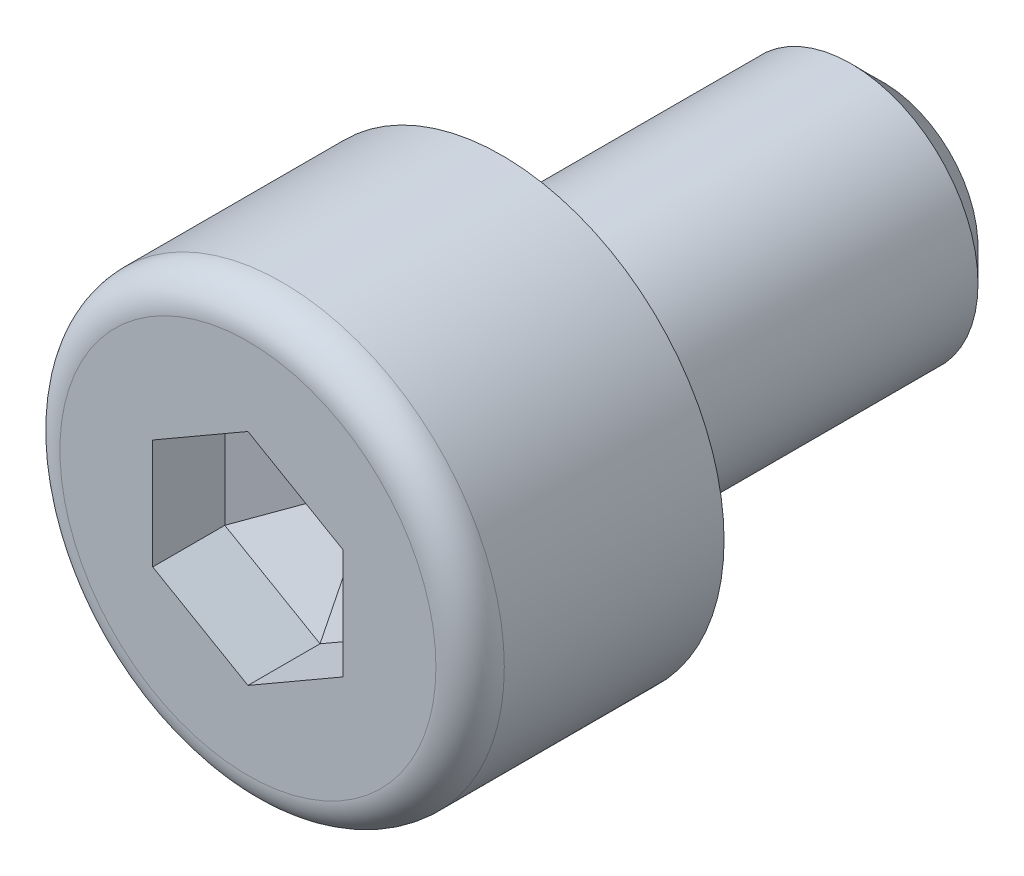
ISO-10303-21;
HEADER;
FILE_DESCRIPTION(('STEP AP214'),'2;1');
FILE_NAME('part.step','',(''),(''),'','','');
FILE_SCHEMA(('AUTOMOTIVE_DESIGN { 1 0 10303 214 1 1 1 1 }'));
ENDSEC;
DATA;
#1=APPLICATION_CONTEXT('core data for automotive mechanical design processes');
#2=APPLICATION_PROTOCOL_DEFINITION('international standard','automotive_design',2000,#1);
#3=PRODUCT_CONTEXT('',#1,'mechanical');
#4=PRODUCT('Part','Part','',(#3));
#5=PRODUCT_RELATED_PRODUCT_CATEGORY('part','',(#4));
#6=PRODUCT_DEFINITION_FORMATION('','',#4);
#7=PRODUCT_DEFINITION_CONTEXT('part definition',#1,'design');
#8=PRODUCT_DEFINITION('design','',#6,#7);
#9=PRODUCT_DEFINITION_SHAPE('','',#8);
#10=(LENGTH_UNIT() NAMED_UNIT(*) SI_UNIT(.MILLI.,.METRE.));
#11=(NAMED_UNIT(*) PLANE_ANGLE_UNIT() SI_UNIT($,.RADIAN.));
#12=(NAMED_UNIT(*) SI_UNIT($,.STERADIAN.) SOLID_ANGLE_UNIT());
#13=UNCERTAINTY_MEASURE_WITH_UNIT(LENGTH_MEASURE(1.E-05),#10,'distance_accuracy_value','');
#14=(GEOMETRIC_REPRESENTATION_CONTEXT(3) GLOBAL_UNCERTAINTY_ASSIGNED_CONTEXT((#13)) GLOBAL_UNIT_ASSIGNED_CONTEXT((#10,
#11,#12)) REPRESENTATION_CONTEXT('',''));
#15=CARTESIAN_POINT('',(0.,0.,0.));
#16=DIRECTION('',(0.,0.,1.));
#17=DIRECTION('',(1.,0.,0.));
#18=AXIS2_PLACEMENT_3D('',#15,#16,#17);
#19=CARTESIAN_POINT('',(0.,0.,0.));
#20=DIRECTION('',(0.,0.,1.));
#21=DIRECTION('',(1.,0.,0.));
#22=AXIS2_PLACEMENT_3D('',#19,#20,#21);
#23=PLANE('',#22);
#24=CARTESIAN_POINT('',(0.,0.,0.));
#25=DIRECTION('',(0.,0.,1.));
#26=DIRECTION('',(1.,0.,0.));
#27=AXIS2_PLACEMENT_3D('',#24,#25,#26);
#28=CIRCLE('',#27,2.1);
#29=CARTESIAN_POINT('',(2.1,0.,0.));
#30=VERTEX_POINT('',#29);
#31=EDGE_CURVE('E11',#30,#30,#28,.T.);
#32=ORIENTED_EDGE('',*,*,#31,.T.);
#33=EDGE_LOOP('',(#32));
#34=FACE_BOUND('',#33,.T.);
#35=CARTESIAN_POINT('',(0.,0.,0.));
#36=DIRECTION('',(0.,0.,1.));
#37=DIRECTION('',(1.,0.,0.));
#38=AXIS2_PLACEMENT_3D('',#35,#36,#37);
#39=CIRCLE('',#38,3.5);
#40=CARTESIAN_POINT('',(3.5,0.,0.));
#41=VERTEX_POINT('',#40);
#42=EDGE_CURVE('E153',#41,#41,#39,.T.);
#43=ORIENTED_EDGE('',*,*,#42,.F.);
#44=EDGE_LOOP('',(#43));
#45=FACE_BOUND('',#44,.T.);
#46=ADVANCED_FACE('F44',(#34,#45),#23,.F.);
#47=CARTESIAN_POINT('',(0.,0.,4.));
#48=DIRECTION('',(0.,0.,-1.));
#49=DIRECTION('',(-1.,0.,0.));
#50=AXIS2_PLACEMENT_3D('',#47,#48,#49);
#51=CYLINDRICAL_SURFACE('',#50,3.5);
#52=CARTESIAN_POINT('',(0.,0.,3.46153846153846));
#53=DIRECTION('',(0.,0.,1.));
#54=DIRECTION('',(1.,0.,0.));
#55=AXIS2_PLACEMENT_3D('',#52,#53,#54);
#56=CIRCLE('',#55,3.5);
#57=CARTESIAN_POINT('',(3.5,0.,3.46153846153846));
#58=VERTEX_POINT('',#57);
#59=EDGE_CURVE('E173',#58,#58,#56,.F.);
#60=ORIENTED_EDGE('',*,*,#59,.T.);
#61=EDGE_LOOP('',(#60));
#62=FACE_BOUND('',#61,.T.);
#63=ORIENTED_EDGE('',*,*,#42,.T.);
#64=EDGE_LOOP('',(#63));
#65=FACE_BOUND('',#64,.T.);
#66=ADVANCED_FACE('F235',(#62,#65),#51,.T.);
#67=CARTESIAN_POINT('',(0.,0.,4.));
#68=DIRECTION('',(0.,0.,1.));
#69=DIRECTION('',(1.,0.,0.));
#70=AXIS2_PLACEMENT_3D('',#67,#68,#69);
#71=PLANE('',#70);
#72=CARTESIAN_POINT('',(0.,0.,4.));
#73=DIRECTION('',(0.,0.,1.));
#74=DIRECTION('',(1.,0.,0.));
#75=AXIS2_PLACEMENT_3D('',#72,#73,#74);
#76=CIRCLE('',#75,2.96153846153846);
#77=CARTESIAN_POINT('',(2.96153846153846,0.,4.));
#78=VERTEX_POINT('',#77);
#79=EDGE_CURVE('E167',#78,#78,#76,.T.);
#80=ORIENTED_EDGE('',*,*,#79,.T.);
#81=EDGE_LOOP('',(#80));
#82=FACE_BOUND('',#81,.T.);
#83=DIRECTION('',(0.,1.,0.));
#84=VECTOR('',#83,1.);
#85=CARTESIAN_POINT('',(1.5,-0.866025403784439,4.));
#86=LINE('',#85,#84);
#87=CARTESIAN_POINT('',(1.5,-0.866025403784439,4.));
#88=VERTEX_POINT('',#87);
#89=CARTESIAN_POINT('',(1.5,0.866025403784439,4.));
#90=VERTEX_POINT('',#89);
#91=EDGE_CURVE('E140',#88,#90,#86,.T.);
#92=ORIENTED_EDGE('',*,*,#91,.F.);
#93=DIRECTION('',(0.866025403784439,0.5,0.));
#94=VECTOR('',#93,1.);
#95=CARTESIAN_POINT('',(0.,-1.73205080756888,4.));
#96=LINE('',#95,#94);
#97=CARTESIAN_POINT('',(0.,-1.73205080756888,4.));
#98=VERTEX_POINT('',#97);
#99=EDGE_CURVE('E149',#98,#88,#96,.T.);
#100=ORIENTED_EDGE('',*,*,#99,.F.);
#101=DIRECTION('',(0.866025403784439,-0.5,0.));
#102=VECTOR('',#101,1.);
#103=CARTESIAN_POINT('',(-1.5,-0.866025403784438,4.));
#104=LINE('',#103,#102);
#105=CARTESIAN_POINT('',(-1.5,-0.866025403784438,4.));
#106=VERTEX_POINT('',#105);
#107=EDGE_CURVE('E144',#106,#98,#104,.T.);
#108=ORIENTED_EDGE('',*,*,#107,.F.);
#109=DIRECTION('',(0.,-1.,0.));
#110=VECTOR('',#109,1.);
#111=CARTESIAN_POINT('',(-1.5,0.866025403784439,4.));
#112=LINE('',#111,#110);
#113=CARTESIAN_POINT('',(-1.5,0.866025403784439,4.));
#114=VERTEX_POINT('',#113);
#115=EDGE_CURVE('E145',#114,#106,#112,.T.);
#116=ORIENTED_EDGE('',*,*,#115,.F.);
#117=DIRECTION('',(-0.866025403784439,-0.5,0.));
#118=VECTOR('',#117,1.);
#119=CARTESIAN_POINT('',(0.,1.73205080756888,4.));
#120=LINE('',#119,#118);
#121=CARTESIAN_POINT('',(0.,1.73205080756888,4.));
#122=VERTEX_POINT('',#121);
#123=EDGE_CURVE('E125',#122,#114,#120,.T.);
#124=ORIENTED_EDGE('',*,*,#123,.F.);
#125=DIRECTION('',(-0.866025403784439,0.5,0.));
#126=VECTOR('',#125,1.);
#127=CARTESIAN_POINT('',(1.5,0.866025403784439,4.));
#128=LINE('',#127,#126);
#129=EDGE_CURVE('E135',#90,#122,#128,.T.);
#130=ORIENTED_EDGE('',*,*,#129,.F.);
#131=EDGE_LOOP('',(#92,#100,#108,#116,#124,#130));
#132=FACE_BOUND('',#131,.T.);
#133=ADVANCED_FACE('F137',(#82,#132),#71,.T.);
#134=CARTESIAN_POINT('',(1.5,-0.866025403784439,2.));
#135=DIRECTION('',(1.,0.,0.));
#136=DIRECTION('',(0.,1.,0.));
#137=AXIS2_PLACEMENT_3D('',#134,#135,#136);
#138=PLANE('',#137);
#139=DIRECTION('',(0.,0.,1.));
#140=VECTOR('',#139,1.);
#141=CARTESIAN_POINT('',(1.5,0.866025403784439,2.));
#142=LINE('',#141,#140);
#143=CARTESIAN_POINT('',(1.5,0.866025403784439,2.86455331412104));
#144=VERTEX_POINT('',#143);
#145=EDGE_CURVE('E127',#144,#90,#142,.T.);
#146=ORIENTED_EDGE('',*,*,#145,.F.);
#147=DIRECTION('',(0.,-1.,0.));
#148=VECTOR('',#147,1.);
#149=CARTESIAN_POINT('',(1.5,-0.866025403784439,2.86455331412104));
#150=LINE('',#149,#148);
#151=CARTESIAN_POINT('',(1.5,-0.866025403784439,2.86455331412104));
#152=VERTEX_POINT('',#151);
#153=EDGE_CURVE('E69',#144,#152,#150,.T.);
#154=ORIENTED_EDGE('',*,*,#153,.T.);
#155=DIRECTION('',(0.,0.,1.));
#156=VECTOR('',#155,1.);
#157=CARTESIAN_POINT('',(1.5,-0.866025403784439,2.));
#158=LINE('',#157,#156);
#159=EDGE_CURVE('E154',#152,#88,#158,.T.);
#160=ORIENTED_EDGE('',*,*,#159,.T.);
#161=ORIENTED_EDGE('',*,*,#91,.T.);
#162=EDGE_LOOP('',(#146,#154,#160,#161));
#163=FACE_BOUND('',#162,.T.);
#164=ADVANCED_FACE('F292',(#163),#138,.F.);
#165=CARTESIAN_POINT('',(0.,-1.73205080756888,2.));
#166=DIRECTION('',(0.5,-0.866025403784439,0.));
#167=DIRECTION('',(0.866025403784439,0.5,0.));
#168=AXIS2_PLACEMENT_3D('',#165,#166,#167);
#169=PLANE('',#168);
#170=ORIENTED_EDGE('',*,*,#159,.F.);
#171=DIRECTION('',(-0.866025403784439,-0.5,0.));
#172=VECTOR('',#171,1.);
#173=CARTESIAN_POINT('',(0.,-1.73205080756888,2.86455331412104));
#174=LINE('',#173,#172);
#175=CARTESIAN_POINT('',(0.,-1.73205080756888,2.86455331412104));
#176=VERTEX_POINT('',#175);
#177=EDGE_CURVE('E58',#152,#176,#174,.T.);
#178=ORIENTED_EDGE('',*,*,#177,.T.);
#179=DIRECTION('',(0.,0.,1.));
#180=VECTOR('',#179,1.);
#181=CARTESIAN_POINT('',(0.,-1.73205080756888,2.));
#182=LINE('',#181,#180);
#183=EDGE_CURVE('E156',#176,#98,#182,.T.);
#184=ORIENTED_EDGE('',*,*,#183,.T.);
#185=ORIENTED_EDGE('',*,*,#99,.T.);
#186=EDGE_LOOP('',(#170,#178,#184,#185));
#187=FACE_BOUND('',#186,.T.);
#188=ADVANCED_FACE('F295',(#187),#169,.F.);
#189=CARTESIAN_POINT('',(-1.5,-0.866025403784438,2.));
#190=DIRECTION('',(-0.5,-0.866025403784439,0.));
#191=DIRECTION('',(0.866025403784439,-0.5,0.));
#192=AXIS2_PLACEMENT_3D('',#189,#190,#191);
#193=PLANE('',#192);
#194=ORIENTED_EDGE('',*,*,#183,.F.);
#195=DIRECTION('',(-0.866025403784439,0.5,0.));
#196=VECTOR('',#195,1.);
#197=CARTESIAN_POINT('',(-1.5,-0.866025403784438,2.86455331412104));
#198=LINE('',#197,#196);
#199=CARTESIAN_POINT('',(-1.5,-0.866025403784438,2.86455331412104));
#200=VERTEX_POINT('',#199);
#201=EDGE_CURVE('E197',#176,#200,#198,.T.);
#202=ORIENTED_EDGE('',*,*,#201,.T.);
#203=DIRECTION('',(0.,0.,1.));
#204=VECTOR('',#203,1.);
#205=CARTESIAN_POINT('',(-1.5,-0.866025403784438,2.));
#206=LINE('',#205,#204);
#207=EDGE_CURVE('E158',#200,#106,#206,.T.);
#208=ORIENTED_EDGE('',*,*,#207,.T.);
#209=ORIENTED_EDGE('',*,*,#107,.T.);
#210=EDGE_LOOP('',(#194,#202,#208,#209));
#211=FACE_BOUND('',#210,.T.);
#212=ADVANCED_FACE('F284',(#211),#193,.F.);
#213=CARTESIAN_POINT('',(-1.5,0.866025403784439,2.));
#214=DIRECTION('',(-1.,0.,0.));
#215=DIRECTION('',(0.,0.,1.));
#216=AXIS2_PLACEMENT_3D('',#213,#214,#215);
#217=PLANE('',#216);
#218=ORIENTED_EDGE('',*,*,#207,.F.);
#219=DIRECTION('',(0.,1.,0.));
#220=VECTOR('',#219,1.);
#221=CARTESIAN_POINT('',(-1.5,0.866025403784439,2.86455331412104));
#222=LINE('',#221,#220);
#223=CARTESIAN_POINT('',(-1.5,0.866025403784439,2.86455331412104));
#224=VERTEX_POINT('',#223);
#225=EDGE_CURVE('E186',#200,#224,#222,.T.);
#226=ORIENTED_EDGE('',*,*,#225,.T.);
#227=DIRECTION('',(0.,0.,1.));
#228=VECTOR('',#227,1.);
#229=CARTESIAN_POINT('',(-1.5,0.866025403784439,2.));
#230=LINE('',#229,#228);
#231=EDGE_CURVE('E126',#224,#114,#230,.T.);
#232=ORIENTED_EDGE('',*,*,#231,.T.);
#233=ORIENTED_EDGE('',*,*,#115,.T.);
#234=EDGE_LOOP('',(#218,#226,#232,#233));
#235=FACE_BOUND('',#234,.T.);
#236=ADVANCED_FACE('F286',(#235),#217,.F.);
#237=CARTESIAN_POINT('',(0.,1.73205080756888,2.));
#238=DIRECTION('',(-0.5,0.866025403784439,0.));
#239=DIRECTION('',(-0.866025403784439,-0.5,0.));
#240=AXIS2_PLACEMENT_3D('',#237,#238,#239);
#241=PLANE('',#240);
#242=ORIENTED_EDGE('',*,*,#231,.F.);
#243=DIRECTION('',(0.866025403784439,0.5,0.));
#244=VECTOR('',#243,1.);
#245=CARTESIAN_POINT('',(0.,1.73205080756888,2.86455331412104));
#246=LINE('',#245,#244);
#247=CARTESIAN_POINT('',(0.,1.73205080756888,2.86455331412104));
#248=VERTEX_POINT('',#247);
#249=EDGE_CURVE('E123',#224,#248,#246,.T.);
#250=ORIENTED_EDGE('',*,*,#249,.T.);
#251=DIRECTION('',(0.,0.,1.));
#252=VECTOR('',#251,1.);
#253=CARTESIAN_POINT('',(0.,1.73205080756888,2.));
#254=LINE('',#253,#252);
#255=EDGE_CURVE('E120',#248,#122,#254,.T.);
#256=ORIENTED_EDGE('',*,*,#255,.T.);
#257=ORIENTED_EDGE('',*,*,#123,.T.);
#258=EDGE_LOOP('',(#242,#250,#256,#257));
#259=FACE_BOUND('',#258,.T.);
#260=ADVANCED_FACE('F119',(#259),#241,.F.);
#261=CARTESIAN_POINT('',(1.5,0.866025403784439,2.));
#262=DIRECTION('',(0.5,0.866025403784439,0.));
#263=DIRECTION('',(-0.866025403784439,0.5,0.));
#264=AXIS2_PLACEMENT_3D('',#261,#262,#263);
#265=PLANE('',#264);
#266=ORIENTED_EDGE('',*,*,#255,.F.);
#267=DIRECTION('',(0.866025403784439,-0.5,0.));
#268=VECTOR('',#267,1.);
#269=CARTESIAN_POINT('',(1.5,0.866025403784439,2.86455331412104));
#270=LINE('',#269,#268);
#271=EDGE_CURVE('E191',#248,#144,#270,.T.);
#272=ORIENTED_EDGE('',*,*,#271,.T.);
#273=ORIENTED_EDGE('',*,*,#145,.T.);
#274=ORIENTED_EDGE('',*,*,#129,.T.);
#275=EDGE_LOOP('',(#266,#272,#273,#274));
#276=FACE_BOUND('',#275,.T.);
#277=ADVANCED_FACE('F134',(#276),#265,.F.);
#278=CARTESIAN_POINT('',(0.,0.,2.));
#279=DIRECTION('',(0.,0.,1.));
#280=DIRECTION('',(1.,0.,0.));
#281=AXIS2_PLACEMENT_3D('',#278,#279,#280);
#282=PLANE('',#281);
#283=DIRECTION('',(-0.866025403784439,-0.5,0.));
#284=VECTOR('',#283,1.);
#285=CARTESIAN_POINT('',(-0.00127486704514361,0.00220813449508394,2.));
#286=LINE('',#285,#284);
#287=CARTESIAN_POINT('',(0.,0.00294417932677902,2.));
#288=VERTEX_POINT('',#287);
#289=CARTESIAN_POINT('',(-0.00254973409028784,0.00147208966338895,2.));
#290=VERTEX_POINT('',#289);
#291=EDGE_CURVE('E183',#288,#290,#286,.T.);
#292=ORIENTED_EDGE('',*,*,#291,.T.);
#293=DIRECTION('',(0.,-1.,0.));
#294=VECTOR('',#293,1.);
#295=CARTESIAN_POINT('',(-0.00254973409028782,0.,2.));
#296=LINE('',#295,#294);
#297=CARTESIAN_POINT('',(-0.00254973409028782,-0.00147208966338878,2.));
#298=VERTEX_POINT('',#297);
#299=EDGE_CURVE('E187',#290,#298,#296,.T.);
#300=ORIENTED_EDGE('',*,*,#299,.T.);
#301=DIRECTION('',(0.866025403784439,-0.5,0.));
#302=VECTOR('',#301,1.);
#303=CARTESIAN_POINT('',(-0.00127486704514353,-0.0022081344950838,2.));
#304=LINE('',#303,#302);
#305=CARTESIAN_POINT('',(0.,-0.00294417932677885,2.));
#306=VERTEX_POINT('',#305);
#307=EDGE_CURVE('E178',#298,#306,#304,.T.);
#308=ORIENTED_EDGE('',*,*,#307,.T.);
#309=DIRECTION('',(0.866025403784439,0.5,0.));
#310=VECTOR('',#309,1.);
#311=CARTESIAN_POINT('',(0.00127486704514388,-0.00220813449508441,2.));
#312=LINE('',#311,#310);
#313=CARTESIAN_POINT('',(0.00254973409028771,-0.00147208966338966,2.));
#314=VERTEX_POINT('',#313);
#315=EDGE_CURVE('E176',#306,#314,#312,.T.);
#316=ORIENTED_EDGE('',*,*,#315,.T.);
#317=DIRECTION('',(0.,1.,0.));
#318=VECTOR('',#317,1.);
#319=CARTESIAN_POINT('',(0.00254973409028771,0.,2.));
#320=LINE('',#319,#318);
#321=CARTESIAN_POINT('',(0.00254973409028771,0.00147208966338983,2.));
#322=VERTEX_POINT('',#321);
#323=EDGE_CURVE('E179',#314,#322,#320,.T.);
#324=ORIENTED_EDGE('',*,*,#323,.T.);
#325=DIRECTION('',(-0.866025403784439,0.5,0.));
#326=VECTOR('',#325,1.);
#327=CARTESIAN_POINT('',(0.00127486704514396,0.00220813449508455,2.));
#328=LINE('',#327,#326);
#329=EDGE_CURVE('E185',#322,#288,#328,.T.);
#330=ORIENTED_EDGE('',*,*,#329,.T.);
#331=EDGE_LOOP('',(#292,#300,#308,#316,#324,#330));
#332=FACE_BOUND('',#331,.T.);
#333=ADVANCED_FACE('F303',(#332),#282,.T.);
#334=CARTESIAN_POINT('',(0.,0.,-6.));
#335=DIRECTION('',(0.,0.,1.));
#336=DIRECTION('',(1.,0.,0.));
#337=AXIS2_PLACEMENT_3D('',#334,#335,#336);
#338=CYLINDRICAL_SURFACE('',#337,2.);
#339=CARTESIAN_POINT('',(0.,0.,-0.1));
#340=DIRECTION('',(0.,0.,1.));
#341=DIRECTION('',(1.,0.,0.));
#342=AXIS2_PLACEMENT_3D('',#339,#340,#341);
#343=CIRCLE('',#342,2.);
#344=CARTESIAN_POINT('',(2.,0.,-0.1));
#345=VERTEX_POINT('',#344);
#346=EDGE_CURVE('E52',#345,#345,#343,.F.);
#347=ORIENTED_EDGE('',*,*,#346,.T.);
#348=EDGE_LOOP('',(#347));
#349=FACE_BOUND('',#348,.T.);
#350=CARTESIAN_POINT('',(0.,0.,-5.5));
#351=DIRECTION('',(0.,0.,-1.));
#352=DIRECTION('',(-1.,0.,0.));
#353=AXIS2_PLACEMENT_3D('',#350,#351,#352);
#354=CIRCLE('',#353,2.);
#355=CARTESIAN_POINT('',(-2.,0.,-5.5));
#356=VERTEX_POINT('',#355);
#357=EDGE_CURVE('E170',#356,#356,#354,.F.);
#358=ORIENTED_EDGE('',*,*,#357,.T.);
#359=EDGE_LOOP('',(#358));
#360=FACE_BOUND('',#359,.T.);
#361=ADVANCED_FACE('F220',(#349,#360),#338,.T.);
#362=CARTESIAN_POINT('',(0.,0.,-6.));
#363=DIRECTION('',(0.,0.,-1.));
#364=DIRECTION('',(-1.,0.,0.));
#365=AXIS2_PLACEMENT_3D('',#362,#363,#364);
#366=PLANE('',#365);
#367=CARTESIAN_POINT('',(0.,0.,-6.));
#368=DIRECTION('',(0.,0.,-1.));
#369=DIRECTION('',(-1.,0.,0.));
#370=AXIS2_PLACEMENT_3D('',#367,#368,#369);
#371=CIRCLE('',#370,1.5);
#372=CARTESIAN_POINT('',(-1.5,0.,-6.));
#373=VERTEX_POINT('',#372);
#374=EDGE_CURVE('E165',#373,#373,#371,.T.);
#375=ORIENTED_EDGE('',*,*,#374,.T.);
#376=EDGE_LOOP('',(#375));
#377=FACE_BOUND('',#376,.T.);
#378=ADVANCED_FACE('F247',(#377),#366,.T.);
#379=CARTESIAN_POINT('',(0.,0.,-6.));
#380=DIRECTION('',(0.,0.,1.));
#381=DIRECTION('',(1.,0.,0.));
#382=AXIS2_PLACEMENT_3D('',#379,#380,#381);
#383=CONICAL_SURFACE('',#382,1.5,0.785398163397447);
#384=ORIENTED_EDGE('',*,*,#357,.F.);
#385=EDGE_LOOP('',(#384));
#386=FACE_BOUND('',#385,.T.);
#387=ORIENTED_EDGE('',*,*,#374,.F.);
#388=EDGE_LOOP('',(#387));
#389=FACE_BOUND('',#388,.T.);
#390=ADVANCED_FACE('F242',(#386,#389),#383,.T.);
#391=CARTESIAN_POINT('',(0.,0.,3.46153846153846));
#392=DIRECTION('',(0.,0.,1.));
#393=DIRECTION('',(1.,0.,0.));
#394=AXIS2_PLACEMENT_3D('',#391,#392,#393);
#395=TOROIDAL_SURFACE('',#394,2.96153846153846,0.538461538461538);
#396=ORIENTED_EDGE('',*,*,#59,.F.);
#397=EDGE_LOOP('',(#396));
#398=FACE_BOUND('',#397,.T.);
#399=ORIENTED_EDGE('',*,*,#79,.F.);
#400=EDGE_LOOP('',(#399));
#401=FACE_BOUND('',#400,.T.);
#402=ADVANCED_FACE('F250',(#398,#401),#395,.T.);
#403=CARTESIAN_POINT('',(0.00254973409028771,0.,2.));
#404=DIRECTION('',(0.499999999999995,0.,-0.866025403784442));
#405=DIRECTION('',(0.,1.,0.));
#406=AXIS2_PLACEMENT_3D('',#403,#404,#405);
#407=PLANE('',#406);
#408=DIRECTION('',(-0.774596669241485,0.447213595499959,-0.447213595499953));
#409=VECTOR('',#408,1.);
#410=CARTESIAN_POINT('',(0.00203978727223012,-0.00117767173071176,1.99970558206732));
#411=LINE('',#410,#409);
#412=EDGE_CURVE('E209',#152,#314,#411,.T.);
#413=ORIENTED_EDGE('',*,*,#412,.F.);
#414=ORIENTED_EDGE('',*,*,#153,.F.);
#415=DIRECTION('',(-0.774596669241485,-0.447213595499959,-0.447213595499953));
#416=VECTOR('',#415,1.);
#417=CARTESIAN_POINT('',(0.00203978727223023,0.00117767173071207,1.99970558206732));
#418=LINE('',#417,#416);
#419=EDGE_CURVE('E215',#322,#144,#418,.F.);
#420=ORIENTED_EDGE('',*,*,#419,.F.);
#421=ORIENTED_EDGE('',*,*,#323,.F.);
#422=EDGE_LOOP('',(#413,#414,#420,#421));
#423=FACE_BOUND('',#422,.T.);
#424=ADVANCED_FACE('F252',(#423),#407,.F.);
#425=CARTESIAN_POINT('',(0.00127486704514402,0.00220813449508464,2.));
#426=DIRECTION('',(0.249999999999997,0.433012701892215,-0.866025403784441));
#427=DIRECTION('',(-0.866025403784439,0.5,0.));
#428=AXIS2_PLACEMENT_3D('',#425,#426,#427);
#429=PLANE('',#428);
#430=ORIENTED_EDGE('',*,*,#419,.T.);
#431=ORIENTED_EDGE('',*,*,#271,.F.);
#432=DIRECTION('',(0.,-0.894427190999918,-0.447213595499953));
#433=VECTOR('',#432,1.);
#434=CARTESIAN_POINT('',(0.,0.00235534346142291,1.99970558206732));
#435=LINE('',#434,#433);
#436=EDGE_CURVE('E207',#288,#248,#435,.F.);
#437=ORIENTED_EDGE('',*,*,#436,.F.);
#438=ORIENTED_EDGE('',*,*,#329,.F.);
#439=EDGE_LOOP('',(#430,#431,#437,#438));
#440=FACE_BOUND('',#439,.T.);
#441=ADVANCED_FACE('F261',(#440),#429,.F.);
#442=CARTESIAN_POINT('',(0.00127486704514391,-0.00220813449508446,2.));
#443=DIRECTION('',(0.249999999999997,-0.433012701892215,-0.866025403784442));
#444=DIRECTION('',(0.866025403784439,0.5,0.));
#445=AXIS2_PLACEMENT_3D('',#442,#443,#444);
#446=PLANE('',#445);
#447=ORIENTED_EDGE('',*,*,#412,.T.);
#448=ORIENTED_EDGE('',*,*,#315,.F.);
#449=DIRECTION('',(0.,-0.894427190999918,0.447213595499953));
#450=VECTOR('',#449,1.);
#451=CARTESIAN_POINT('',(0.,-0.00235534346142289,1.99970558206732));
#452=LINE('',#451,#450);
#453=EDGE_CURVE('E203',#176,#306,#452,.F.);
#454=ORIENTED_EDGE('',*,*,#453,.F.);
#455=ORIENTED_EDGE('',*,*,#177,.F.);
#456=EDGE_LOOP('',(#447,#448,#454,#455));
#457=FACE_BOUND('',#456,.T.);
#458=ADVANCED_FACE('F259',(#457),#446,.F.);
#459=CARTESIAN_POINT('',(-0.00127486704514358,0.00220813449508389,2.));
#460=DIRECTION('',(-0.249999999999997,0.433012701892215,-0.866025403784442));
#461=DIRECTION('',(-0.866025403784439,-0.5,0.));
#462=AXIS2_PLACEMENT_3D('',#459,#460,#461);
#463=PLANE('',#462);
#464=ORIENTED_EDGE('',*,*,#436,.T.);
#465=ORIENTED_EDGE('',*,*,#249,.F.);
#466=DIRECTION('',(0.774596669241485,-0.44721359549996,-0.447213595499953));
#467=VECTOR('',#466,1.);
#468=CARTESIAN_POINT('',(-0.00203978727223051,0.00117767173071111,1.99970558206732));
#469=LINE('',#468,#467);
#470=EDGE_CURVE('E201',#290,#224,#469,.F.);
#471=ORIENTED_EDGE('',*,*,#470,.F.);
#472=ORIENTED_EDGE('',*,*,#291,.F.);
#473=EDGE_LOOP('',(#464,#465,#471,#472));
#474=FACE_BOUND('',#473,.T.);
#475=ADVANCED_FACE('F258',(#474),#463,.F.);
#476=CARTESIAN_POINT('',(-0.00127486704514358,-0.00220813449508389,2.));
#477=DIRECTION('',(-0.249999999999997,-0.433012701892215,-0.866025403784442));
#478=DIRECTION('',(0.866025403784439,-0.5,0.));
#479=AXIS2_PLACEMENT_3D('',#476,#477,#478);
#480=PLANE('',#479);
#481=ORIENTED_EDGE('',*,*,#453,.T.);
#482=ORIENTED_EDGE('',*,*,#307,.F.);
#483=DIRECTION('',(-0.774596669241485,-0.44721359549996,0.447213595499953));
#484=VECTOR('',#483,1.);
#485=CARTESIAN_POINT('',(-0.00203978727223051,-0.00117767173071111,1.99970558206732));
#486=LINE('',#485,#484);
#487=EDGE_CURVE('E196',#200,#298,#486,.F.);
#488=ORIENTED_EDGE('',*,*,#487,.F.);
#489=ORIENTED_EDGE('',*,*,#201,.F.);
#490=EDGE_LOOP('',(#481,#482,#488,#489));
#491=FACE_BOUND('',#490,.T.);
#492=ADVANCED_FACE('F227',(#491),#480,.F.);
#493=CARTESIAN_POINT('',(-0.00254973409028782,0.,2.));
#494=DIRECTION('',(-0.499999999999995,0.,-0.866025403784442));
#495=DIRECTION('',(0.,-1.,0.));
#496=AXIS2_PLACEMENT_3D('',#493,#494,#495);
#497=PLANE('',#496);
#498=ORIENTED_EDGE('',*,*,#470,.T.);
#499=ORIENTED_EDGE('',*,*,#225,.F.);
#500=ORIENTED_EDGE('',*,*,#487,.T.);
#501=ORIENTED_EDGE('',*,*,#299,.F.);
#502=EDGE_LOOP('',(#498,#499,#500,#501));
#503=FACE_BOUND('',#502,.T.);
#504=ADVANCED_FACE('F221',(#503),#497,.F.);
#505=CARTESIAN_POINT('',(0.,0.,-0.1));
#506=DIRECTION('',(0.,0.,1.));
#507=DIRECTION('',(1.,0.,0.));
#508=AXIS2_PLACEMENT_3D('',#505,#506,#507);
#509=TOROIDAL_SURFACE('',#508,2.1,0.1);
#510=ORIENTED_EDGE('',*,*,#31,.F.);
#511=EDGE_LOOP('',(#510));
#512=FACE_BOUND('',#511,.T.);
#513=ORIENTED_EDGE('',*,*,#346,.F.);
#514=EDGE_LOOP('',(#513));
#515=FACE_BOUND('',#514,.T.);
#516=ADVANCED_FACE('F50',(#512,#515),#509,.F.);
#517=CLOSED_SHELL('',(#46,#66,#133,#164,#188,#212,#236,#260,#277,#333,#361,#378,#390,#402,#424,
#441,#458,#475,#492,#504,#516));
#518=MANIFOLD_SOLID_BREP('B2',#517);
#519=ADVANCED_BREP_SHAPE_REPRESENTATION('',(#18,#518),#14);
#520=SHAPE_DEFINITION_REPRESENTATION(#9,#519);
ENDSEC;
END-ISO-10303-21;
